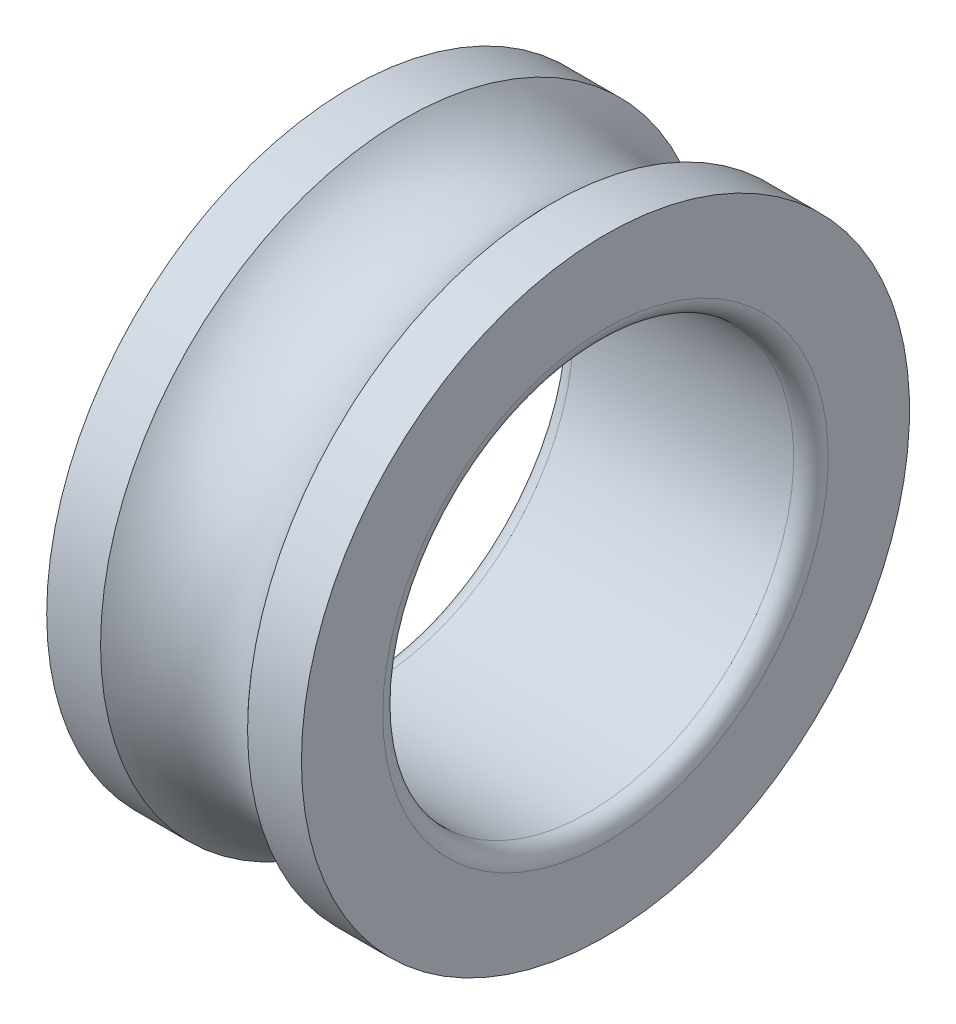
ISO-10303-21;
HEADER;
FILE_DESCRIPTION(('STEP AP214'),'2;1');
FILE_NAME('part.step','',(''),(''),'','','');
FILE_SCHEMA(('AUTOMOTIVE_DESIGN { 1 0 10303 214 1 1 1 1 }'));
ENDSEC;
DATA;
#1=APPLICATION_CONTEXT('core data for automotive mechanical design processes');
#2=APPLICATION_PROTOCOL_DEFINITION('international standard','automotive_design',2000,#1);
#3=PRODUCT_CONTEXT('',#1,'mechanical');
#4=PRODUCT('Part','Part','',(#3));
#5=PRODUCT_RELATED_PRODUCT_CATEGORY('part','',(#4));
#6=PRODUCT_DEFINITION_FORMATION('','',#4);
#7=PRODUCT_DEFINITION_CONTEXT('part definition',#1,'design');
#8=PRODUCT_DEFINITION('design','',#6,#7);
#9=PRODUCT_DEFINITION_SHAPE('','',#8);
#10=(LENGTH_UNIT() NAMED_UNIT(*) SI_UNIT(.MILLI.,.METRE.));
#11=(NAMED_UNIT(*) PLANE_ANGLE_UNIT() SI_UNIT($,.RADIAN.));
#12=(NAMED_UNIT(*) SI_UNIT($,.STERADIAN.) SOLID_ANGLE_UNIT());
#13=UNCERTAINTY_MEASURE_WITH_UNIT(LENGTH_MEASURE(1.E-05),#10,'distance_accuracy_value','');
#14=(GEOMETRIC_REPRESENTATION_CONTEXT(3) GLOBAL_UNCERTAINTY_ASSIGNED_CONTEXT((#13)) GLOBAL_UNIT_ASSIGNED_CONTEXT((#10,
#11,#12)) REPRESENTATION_CONTEXT('',''));
#15=CARTESIAN_POINT('',(0.,0.,0.));
#16=DIRECTION('',(0.,0.,1.));
#17=DIRECTION('',(1.,0.,0.));
#18=AXIS2_PLACEMENT_3D('',#15,#16,#17);
#19=CARTESIAN_POINT('',(29.4102065377944,37.,0.));
#20=DIRECTION('',(1.,0.,0.));
#21=DIRECTION('',(0.,0.,-1.));
#22=AXIS2_PLACEMENT_3D('',#19,#20,#21);
#23=PLANE('',#22);
#24=CARTESIAN_POINT('',(29.4102065377944,0.,0.));
#25=DIRECTION('',(-1.,0.,0.));
#26=DIRECTION('',(0.,0.,1.));
#27=AXIS2_PLACEMENT_3D('',#24,#25,#26);
#28=CIRCLE('',#27,27.1);
#29=CARTESIAN_POINT('',(29.4102065377944,0.,27.1));
#30=VERTEX_POINT('',#29);
#31=EDGE_CURVE('E10',#30,#30,#28,.T.);
#32=ORIENTED_EDGE('',*,*,#31,.T.);
#33=EDGE_LOOP('',(#32));
#34=FACE_BOUND('',#33,.T.);
#35=CARTESIAN_POINT('',(29.4102065377944,0.,0.));
#36=DIRECTION('',(-1.,0.,0.));
#37=DIRECTION('',(0.,0.,1.));
#38=AXIS2_PLACEMENT_3D('',#35,#36,#37);
#39=CIRCLE('',#38,37.);
#40=CARTESIAN_POINT('',(29.4102065377944,0.,37.));
#41=VERTEX_POINT('',#40);
#42=EDGE_CURVE('E63',#41,#41,#39,.T.);
#43=ORIENTED_EDGE('',*,*,#42,.F.);
#44=EDGE_LOOP('',(#43));
#45=FACE_BOUND('',#44,.T.);
#46=ADVANCED_FACE('F35',(#34,#45),#23,.T.);
#47=CARTESIAN_POINT('',(27.3102065377944,0.,0.));
#48=DIRECTION('',(-1.,0.,0.));
#49=DIRECTION('',(0.,0.,1.));
#50=AXIS2_PLACEMENT_3D('',#47,#48,#49);
#51=TOROIDAL_SURFACE('',#50,27.1,2.1);
#52=CARTESIAN_POINT('',(27.3102065377944,0.,0.));
#53=DIRECTION('',(-1.,0.,0.));
#54=DIRECTION('',(0.,0.,1.));
#55=AXIS2_PLACEMENT_3D('',#52,#53,#54);
#56=CIRCLE('',#55,25.);
#57=CARTESIAN_POINT('',(27.3102065377944,0.,25.));
#58=VERTEX_POINT('',#57);
#59=EDGE_CURVE('E41',#58,#58,#56,.T.);
#60=ORIENTED_EDGE('',*,*,#59,.T.);
#61=EDGE_LOOP('',(#60));
#62=FACE_BOUND('',#61,.T.);
#63=ORIENTED_EDGE('',*,*,#31,.F.);
#64=EDGE_LOOP('',(#63));
#65=FACE_BOUND('',#64,.T.);
#66=ADVANCED_FACE('F70',(#62,#65),#51,.T.);
#67=CARTESIAN_POINT('',(-42.9047321119683,0.,0.));
#68=DIRECTION('',(-1.,0.,0.));
#69=DIRECTION('',(0.,0.,1.));
#70=AXIS2_PLACEMENT_3D('',#67,#68,#69);
#71=CYLINDRICAL_SURFACE('',#70,25.);
#72=CARTESIAN_POINT('',(0.510206537794412,0.,0.));
#73=DIRECTION('',(-1.,0.,0.));
#74=DIRECTION('',(0.,0.,1.));
#75=AXIS2_PLACEMENT_3D('',#72,#73,#74);
#76=CIRCLE('',#75,25.);
#77=CARTESIAN_POINT('',(0.510206537794412,0.,25.));
#78=VERTEX_POINT('',#77);
#79=EDGE_CURVE('E45',#78,#78,#76,.T.);
#80=ORIENTED_EDGE('',*,*,#79,.T.);
#81=EDGE_LOOP('',(#80));
#82=FACE_BOUND('',#81,.T.);
#83=ORIENTED_EDGE('',*,*,#59,.F.);
#84=EDGE_LOOP('',(#83));
#85=FACE_BOUND('',#84,.T.);
#86=ADVANCED_FACE('F74',(#82,#85),#71,.F.);
#87=CARTESIAN_POINT('',(0.510206537794397,0.,0.));
#88=DIRECTION('',(-1.,0.,0.));
#89=DIRECTION('',(0.,0.,1.));
#90=AXIS2_PLACEMENT_3D('',#87,#88,#89);
#91=TOROIDAL_SURFACE('',#90,27.1,2.1);
#92=CARTESIAN_POINT('',(-1.5897934622056,0.,0.));
#93=DIRECTION('',(-1.,0.,0.));
#94=DIRECTION('',(0.,0.,1.));
#95=AXIS2_PLACEMENT_3D('',#92,#93,#94);
#96=CIRCLE('',#95,27.1);
#97=CARTESIAN_POINT('',(-1.5897934622056,0.,27.1));
#98=VERTEX_POINT('',#97);
#99=EDGE_CURVE('E49',#98,#98,#96,.T.);
#100=ORIENTED_EDGE('',*,*,#99,.T.);
#101=EDGE_LOOP('',(#100));
#102=FACE_BOUND('',#101,.T.);
#103=ORIENTED_EDGE('',*,*,#79,.F.);
#104=EDGE_LOOP('',(#103));
#105=FACE_BOUND('',#104,.T.);
#106=ADVANCED_FACE('F78',(#102,#105),#91,.T.);
#107=CARTESIAN_POINT('',(-1.5897934622056,37.,0.));
#108=DIRECTION('',(1.,0.,0.));
#109=DIRECTION('',(0.,0.,-1.));
#110=AXIS2_PLACEMENT_3D('',#107,#108,#109);
#111=PLANE('',#110);
#112=ORIENTED_EDGE('',*,*,#99,.F.);
#113=EDGE_LOOP('',(#112));
#114=FACE_BOUND('',#113,.T.);
#115=CARTESIAN_POINT('',(-1.5897934622056,0.,0.));
#116=DIRECTION('',(-1.,0.,0.));
#117=DIRECTION('',(0.,0.,1.));
#118=AXIS2_PLACEMENT_3D('',#115,#116,#117);
#119=CIRCLE('',#118,37.);
#120=CARTESIAN_POINT('',(-1.5897934622056,0.,37.));
#121=VERTEX_POINT('',#120);
#122=EDGE_CURVE('E54',#121,#121,#119,.T.);
#123=ORIENTED_EDGE('',*,*,#122,.T.);
#124=EDGE_LOOP('',(#123));
#125=FACE_BOUND('',#124,.T.);
#126=ADVANCED_FACE('F85',(#114,#125),#111,.F.);
#127=CARTESIAN_POINT('',(-42.9047321119683,0.,0.));
#128=DIRECTION('',(-1.,0.,0.));
#129=DIRECTION('',(0.,0.,1.));
#130=AXIS2_PLACEMENT_3D('',#127,#128,#129);
#131=CYLINDRICAL_SURFACE('',#130,37.);
#132=ORIENTED_EDGE('',*,*,#122,.F.);
#133=EDGE_LOOP('',(#132));
#134=FACE_BOUND('',#133,.T.);
#135=CARTESIAN_POINT('',(4.96593462779524,0.,0.));
#136=DIRECTION('',(-1.,0.,0.));
#137=DIRECTION('',(0.,0.,1.));
#138=AXIS2_PLACEMENT_3D('',#135,#136,#137);
#139=CIRCLE('',#138,37.);
#140=CARTESIAN_POINT('',(4.96593462779524,0.,37.));
#141=VERTEX_POINT('',#140);
#142=EDGE_CURVE('E57',#141,#141,#139,.T.);
#143=ORIENTED_EDGE('',*,*,#142,.T.);
#144=EDGE_LOOP('',(#143));
#145=FACE_BOUND('',#144,.T.);
#146=ADVANCED_FACE('F89',(#134,#145),#131,.T.);
#147=CARTESIAN_POINT('',(13.9102065377944,0.,0.));
#148=DIRECTION('',(-1.,0.,0.));
#149=DIRECTION('',(0.,0.,1.));
#150=AXIS2_PLACEMENT_3D('',#147,#148,#149);
#151=TOROIDAL_SURFACE('',#150,45.,12.);
#152=CARTESIAN_POINT('',(22.8544784477936,0.,0.));
#153=DIRECTION('',(-1.,0.,0.));
#154=DIRECTION('',(0.,0.,1.));
#155=AXIS2_PLACEMENT_3D('',#152,#153,#154);
#156=CIRCLE('',#155,37.);
#157=CARTESIAN_POINT('',(22.8544784477936,0.,37.));
#158=VERTEX_POINT('',#157);
#159=EDGE_CURVE('E60',#158,#158,#156,.T.);
#160=ORIENTED_EDGE('',*,*,#159,.T.);
#161=EDGE_LOOP('',(#160));
#162=FACE_BOUND('',#161,.T.);
#163=ORIENTED_EDGE('',*,*,#142,.F.);
#164=EDGE_LOOP('',(#163));
#165=FACE_BOUND('',#164,.T.);
#166=ADVANCED_FACE('F93',(#162,#165),#151,.F.);
#167=CARTESIAN_POINT('',(-42.9047321119683,0.,0.));
#168=DIRECTION('',(-1.,0.,0.));
#169=DIRECTION('',(0.,0.,1.));
#170=AXIS2_PLACEMENT_3D('',#167,#168,#169);
#171=CYLINDRICAL_SURFACE('',#170,37.);
#172=ORIENTED_EDGE('',*,*,#159,.F.);
#173=EDGE_LOOP('',(#172));
#174=FACE_BOUND('',#173,.T.);
#175=ORIENTED_EDGE('',*,*,#42,.T.);
#176=EDGE_LOOP('',(#175));
#177=FACE_BOUND('',#176,.T.);
#178=ADVANCED_FACE('F67',(#174,#177),#171,.T.);
#179=CLOSED_SHELL('',(#46,#66,#86,#106,#126,#146,#166,#178));
#180=MANIFOLD_SOLID_BREP('B2',#179);
#181=ADVANCED_BREP_SHAPE_REPRESENTATION('',(#18,#180),#14);
#182=SHAPE_DEFINITION_REPRESENTATION(#9,#181);
ENDSEC;
END-ISO-10303-21;
